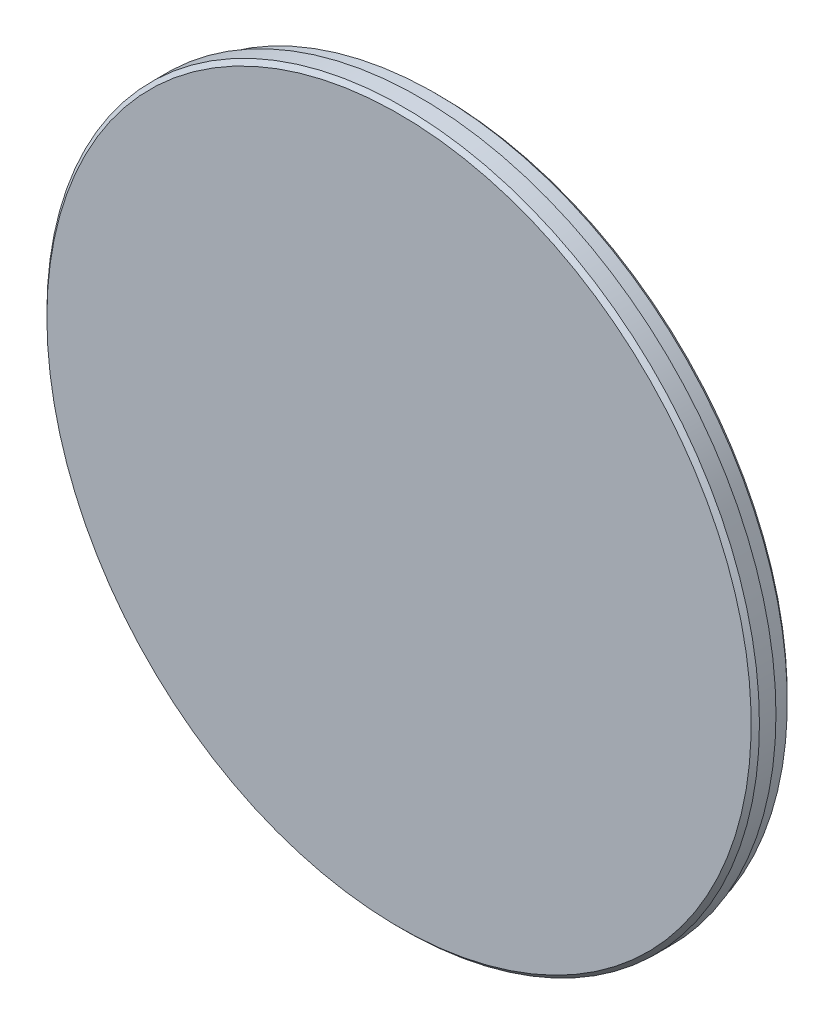
ISO-10303-21;
HEADER;
FILE_DESCRIPTION(('STEP AP214'),'2;1');
FILE_NAME('part.step','',(''),(''),'','','');
FILE_SCHEMA(('AUTOMOTIVE_DESIGN { 1 0 10303 214 1 1 1 1 }'));
ENDSEC;
DATA;
#1=APPLICATION_CONTEXT('core data for automotive mechanical design processes');
#2=APPLICATION_PROTOCOL_DEFINITION('international standard','automotive_design',2000,#1);
#3=PRODUCT_CONTEXT('',#1,'mechanical');
#4=PRODUCT('Part','Part','',(#3));
#5=PRODUCT_RELATED_PRODUCT_CATEGORY('part','',(#4));
#6=PRODUCT_DEFINITION_FORMATION('','',#4);
#7=PRODUCT_DEFINITION_CONTEXT('part definition',#1,'design');
#8=PRODUCT_DEFINITION('design','',#6,#7);
#9=PRODUCT_DEFINITION_SHAPE('','',#8);
#10=(LENGTH_UNIT() NAMED_UNIT(*) SI_UNIT(.MILLI.,.METRE.));
#11=(NAMED_UNIT(*) PLANE_ANGLE_UNIT() SI_UNIT($,.RADIAN.));
#12=(NAMED_UNIT(*) SI_UNIT($,.STERADIAN.) SOLID_ANGLE_UNIT());
#13=UNCERTAINTY_MEASURE_WITH_UNIT(LENGTH_MEASURE(1.E-05),#10,'distance_accuracy_value','');
#14=(GEOMETRIC_REPRESENTATION_CONTEXT(3) GLOBAL_UNCERTAINTY_ASSIGNED_CONTEXT((#13)) GLOBAL_UNIT_ASSIGNED_CONTEXT((#10,
#11,#12)) REPRESENTATION_CONTEXT('',''));
#15=CARTESIAN_POINT('',(0.,0.,0.));
#16=DIRECTION('',(0.,0.,1.));
#17=DIRECTION('',(1.,0.,0.));
#18=AXIS2_PLACEMENT_3D('',#15,#16,#17);
#19=CARTESIAN_POINT('',(0.,0.,-1.));
#20=DIRECTION('',(0.,0.,1.));
#21=DIRECTION('',(1.,0.,0.));
#22=AXIS2_PLACEMENT_3D('',#19,#20,#21);
#23=CYLINDRICAL_SURFACE('',#22,17.25);
#24=CARTESIAN_POINT('',(0.,0.,-0.199999999999988));
#25=DIRECTION('',(0.,0.,1.));
#26=DIRECTION('',(1.,0.,0.));
#27=AXIS2_PLACEMENT_3D('',#24,#25,#26);
#28=CIRCLE('',#27,17.25);
#29=CARTESIAN_POINT('',(-17.25,0.,-0.199999999999988));
#30=VERTEX_POINT('',#29);
#31=EDGE_CURVE('E10',#30,#30,#28,.F.);
#32=ORIENTED_EDGE('',*,*,#31,.T.);
#33=EDGE_LOOP('',(#32));
#34=FACE_BOUND('',#33,.T.);
#35=CARTESIAN_POINT('',(0.,0.,-1.));
#36=DIRECTION('',(0.,0.,1.));
#37=DIRECTION('',(1.,0.,0.));
#38=AXIS2_PLACEMENT_3D('',#35,#36,#37);
#39=CIRCLE('',#38,17.25);
#40=CARTESIAN_POINT('',(17.25,0.,-1.));
#41=VERTEX_POINT('',#40);
#42=EDGE_CURVE('E55',#41,#41,#39,.T.);
#43=ORIENTED_EDGE('',*,*,#42,.T.);
#44=EDGE_LOOP('',(#43));
#45=FACE_BOUND('',#44,.T.);
#46=ADVANCED_FACE('F33',(#34,#45),#23,.T.);
#47=CARTESIAN_POINT('',(0.,0.,-1.));
#48=DIRECTION('',(0.,0.,1.));
#49=DIRECTION('',(1.,0.,0.));
#50=AXIS2_PLACEMENT_3D('',#47,#48,#49);
#51=PLANE('',#50);
#52=CARTESIAN_POINT('',(0.,0.,-1.));
#53=DIRECTION('',(0.,0.,-1.));
#54=DIRECTION('',(-1.,0.,0.));
#55=AXIS2_PLACEMENT_3D('',#52,#53,#54);
#56=CIRCLE('',#55,17.);
#57=CARTESIAN_POINT('',(-17.,0.,-1.));
#58=VERTEX_POINT('',#57);
#59=EDGE_CURVE('E54',#58,#58,#56,.T.);
#60=ORIENTED_EDGE('',*,*,#59,.F.);
#61=EDGE_LOOP('',(#60));
#62=FACE_BOUND('',#61,.T.);
#63=ORIENTED_EDGE('',*,*,#42,.F.);
#64=EDGE_LOOP('',(#63));
#65=FACE_BOUND('',#64,.T.);
#66=ADVANCED_FACE('F63',(#62,#65),#51,.F.);
#67=CARTESIAN_POINT('',(0.,0.,0.));
#68=DIRECTION('',(0.,0.,1.));
#69=DIRECTION('',(1.,0.,0.));
#70=AXIS2_PLACEMENT_3D('',#67,#68,#69);
#71=PLANE('',#70);
#72=CARTESIAN_POINT('',(0.,0.,0.));
#73=DIRECTION('',(0.,0.,1.));
#74=DIRECTION('',(1.,0.,0.));
#75=AXIS2_PLACEMENT_3D('',#72,#73,#74);
#76=CIRCLE('',#75,17.05);
#77=CARTESIAN_POINT('',(-17.05,0.,0.));
#78=VERTEX_POINT('',#77);
#79=EDGE_CURVE('E41',#78,#78,#76,.T.);
#80=ORIENTED_EDGE('',*,*,#79,.T.);
#81=EDGE_LOOP('',(#80));
#82=FACE_BOUND('',#81,.T.);
#83=ADVANCED_FACE('F66',(#82),#71,.T.);
#84=CARTESIAN_POINT('',(0.,0.,-2.));
#85=DIRECTION('',(0.,0.,1.));
#86=DIRECTION('',(1.,0.,0.));
#87=AXIS2_PLACEMENT_3D('',#84,#85,#86);
#88=CYLINDRICAL_SURFACE('',#87,17.);
#89=CARTESIAN_POINT('',(0.,0.,-1.8));
#90=DIRECTION('',(0.,0.,-1.));
#91=DIRECTION('',(-1.,0.,0.));
#92=AXIS2_PLACEMENT_3D('',#89,#90,#91);
#93=CIRCLE('',#92,17.);
#94=CARTESIAN_POINT('',(-17.,0.,-1.8));
#95=VERTEX_POINT('',#94);
#96=EDGE_CURVE('E45',#95,#95,#93,.F.);
#97=ORIENTED_EDGE('',*,*,#96,.T.);
#98=EDGE_LOOP('',(#97));
#99=FACE_BOUND('',#98,.T.);
#100=ORIENTED_EDGE('',*,*,#59,.T.);
#101=EDGE_LOOP('',(#100));
#102=FACE_BOUND('',#101,.T.);
#103=ADVANCED_FACE('F61',(#99,#102),#88,.T.);
#104=CARTESIAN_POINT('',(0.,0.,-2.));
#105=DIRECTION('',(0.,0.,-1.));
#106=DIRECTION('',(-1.,0.,0.));
#107=AXIS2_PLACEMENT_3D('',#104,#105,#106);
#108=PLANE('',#107);
#109=CARTESIAN_POINT('',(0.,0.,-2.));
#110=DIRECTION('',(0.,0.,-1.));
#111=DIRECTION('',(-1.,0.,0.));
#112=AXIS2_PLACEMENT_3D('',#109,#110,#111);
#113=CIRCLE('',#112,16.8);
#114=CARTESIAN_POINT('',(-16.8,0.,-2.));
#115=VERTEX_POINT('',#114);
#116=EDGE_CURVE('E49',#115,#115,#113,.T.);
#117=ORIENTED_EDGE('',*,*,#116,.T.);
#118=EDGE_LOOP('',(#117));
#119=FACE_BOUND('',#118,.T.);
#120=ADVANCED_FACE('F80',(#119),#108,.T.);
#121=CARTESIAN_POINT('',(0.,0.,-2.));
#122=DIRECTION('',(0.,0.,1.));
#123=DIRECTION('',(1.,0.,0.));
#124=AXIS2_PLACEMENT_3D('',#121,#122,#123);
#125=CONICAL_SURFACE('',#124,16.8,0.785398163397457);
#126=ORIENTED_EDGE('',*,*,#96,.F.);
#127=EDGE_LOOP('',(#126));
#128=FACE_BOUND('',#127,.T.);
#129=ORIENTED_EDGE('',*,*,#116,.F.);
#130=EDGE_LOOP('',(#129));
#131=FACE_BOUND('',#130,.T.);
#132=ADVANCED_FACE('F76',(#128,#131),#125,.T.);
#133=CARTESIAN_POINT('',(0.,0.,0.));
#134=DIRECTION('',(0.,0.,-1.));
#135=DIRECTION('',(-1.,0.,0.));
#136=AXIS2_PLACEMENT_3D('',#133,#134,#135);
#137=CONICAL_SURFACE('',#136,17.05,0.785398163397466);
#138=CARTESIAN_POINT('',(-17.25,0.,-0.199999999999988));
#139=CARTESIAN_POINT('',(-17.2479166666667,0.,-0.197916666666655));
#140=CARTESIAN_POINT('',(-17.2458333333333,0.,-0.195833333333322));
#141=CARTESIAN_POINT('',(-17.2416666666667,0.,-0.191666666666656));
#142=CARTESIAN_POINT('',(-17.2395833333333,0.,-0.189583333333322));
#143=CARTESIAN_POINT('',(-17.2354166666667,0.,-0.185416666666656));
#144=CARTESIAN_POINT('',(-17.2333333333333,0.,-0.183333333333322));
#145=CARTESIAN_POINT('',(-17.2291666666667,0.,-0.179166666666656));
#146=CARTESIAN_POINT('',(-17.2270833333333,0.,-0.177083333333323));
#147=CARTESIAN_POINT('',(-17.2229166666667,0.,-0.172916666666657));
#148=CARTESIAN_POINT('',(-17.2208333333333,0.,-0.170833333333324));
#149=CARTESIAN_POINT('',(-17.2166666666667,0.,-0.166666666666657));
#150=CARTESIAN_POINT('',(-17.2145833333333,0.,-0.164583333333324));
#151=CARTESIAN_POINT('',(-17.2104166666667,0.,-0.160416666666657));
#152=CARTESIAN_POINT('',(-17.2083333333333,0.,-0.158333333333324));
#153=CARTESIAN_POINT('',(-17.2041666666667,0.,-0.154166666666658));
#154=CARTESIAN_POINT('',(-17.2020833333333,0.,-0.152083333333325));
#155=CARTESIAN_POINT('',(-17.1979166666667,0.,-0.147916666666658));
#156=CARTESIAN_POINT('',(-17.1958333333333,0.,-0.145833333333325));
#157=CARTESIAN_POINT('',(-17.1916666666667,0.,-0.141666666666658));
#158=CARTESIAN_POINT('',(-17.1895833333333,0.,-0.139583333333325));
#159=CARTESIAN_POINT('',(-17.1854166666667,0.,-0.135416666666659));
#160=CARTESIAN_POINT('',(-17.1833333333333,0.,-0.133333333333326));
#161=CARTESIAN_POINT('',(-17.1791666666667,0.,-0.129166666666659));
#162=CARTESIAN_POINT('',(-17.1770833333333,0.,-0.127083333333326));
#163=CARTESIAN_POINT('',(-17.1729166666667,0.,-0.12291666666666));
#164=CARTESIAN_POINT('',(-17.1708333333333,0.,-0.120833333333326));
#165=CARTESIAN_POINT('',(-17.1666666666667,0.,-0.11666666666666));
#166=CARTESIAN_POINT('',(-17.1645833333333,0.,-0.114583333333327));
#167=CARTESIAN_POINT('',(-17.1604166666667,0.,-0.11041666666666));
#168=CARTESIAN_POINT('',(-17.1583333333333,0.,-0.108333333333327));
#169=CARTESIAN_POINT('',(-17.1541666666667,0.,-0.104166666666661));
#170=CARTESIAN_POINT('',(-17.1520833333333,0.,-0.102083333333327));
#171=CARTESIAN_POINT('',(-17.1479166666667,0.,-0.0979166666666608));
#172=CARTESIAN_POINT('',(-17.1458333333333,0.,-0.095833333333328));
#173=CARTESIAN_POINT('',(-17.1416666666667,0.,-0.0916666666666617));
#174=CARTESIAN_POINT('',(-17.1395833333333,0.,-0.0895833333333282));
#175=CARTESIAN_POINT('',(-17.1354166666667,0.,-0.0854166666666616));
#176=CARTESIAN_POINT('',(-17.1333333333333,0.,-0.0833333333333285));
#177=CARTESIAN_POINT('',(-17.1291666666667,0.,-0.0791666666666621));
#178=CARTESIAN_POINT('',(-17.1270833333333,0.,-0.0770833333333289));
#179=CARTESIAN_POINT('',(-17.1229166666667,0.,-0.0729166666666625));
#180=CARTESIAN_POINT('',(-17.1208333333333,0.,-0.0708333333333293));
#181=CARTESIAN_POINT('',(-17.1166666666667,0.,-0.0666666666666627));
#182=CARTESIAN_POINT('',(-17.1145833333333,0.,-0.0645833333333292));
#183=CARTESIAN_POINT('',(-17.1104166666667,0.,-0.060416666666663));
#184=CARTESIAN_POINT('',(-17.1083333333333,0.,-0.0583333333333302));
#185=CARTESIAN_POINT('',(-17.1041666666667,0.,-0.0541666666666639));
#186=CARTESIAN_POINT('',(-17.1020833333333,0.,-0.0520833333333304));
#187=CARTESIAN_POINT('',(-17.0979166666667,0.,-0.0479166666666638));
#188=CARTESIAN_POINT('',(-17.0958333333333,0.,-0.0458333333333306));
#189=CARTESIAN_POINT('',(-17.0916666666667,0.,-0.0416666666666643));
#190=CARTESIAN_POINT('',(-17.0895833333333,0.,-0.039583333333331));
#191=CARTESIAN_POINT('',(-17.0854166666667,0.,-0.0354166666666646));
#192=CARTESIAN_POINT('',(-17.0833333333333,0.,-0.0333333333333315));
#193=CARTESIAN_POINT('',(-17.0791666666667,0.,-0.0291666666666649));
#194=CARTESIAN_POINT('',(-17.0770833333333,0.,-0.0270833333333314));
#195=CARTESIAN_POINT('',(-17.0729166666667,0.,-0.0229166666666651));
#196=CARTESIAN_POINT('',(-17.0708333333333,0.,-0.0208333333333323));
#197=CARTESIAN_POINT('',(-17.0666666666667,0.,-0.0166666666666661));
#198=CARTESIAN_POINT('',(-17.0645833333333,0.,-0.0145833333333326));
#199=CARTESIAN_POINT('',(-17.0604166666667,0.,-0.010416666666666));
#200=CARTESIAN_POINT('',(-17.0583333333333,0.,-0.0083333333333328));
#201=CARTESIAN_POINT('',(-17.0541666666667,0.,-0.00416666666666648));
#202=CARTESIAN_POINT('',(-17.0520833333333,0.,-0.00208333333333332));
#203=CARTESIAN_POINT('',(-17.05,0.,0.));
#204=B_SPLINE_CURVE_WITH_KNOTS('',3,(#138,#139,#140,#141,#142,#143,#144,#145,#146,#147,#148,
#149,#150,#151,#152,#153,#154,#155,#156,#157,#158,#159,#160,#161,#162,#163,#164,#165,#166,#167,
#168,#169,#170,#171,#172,#173,#174,#175,#176,#177,#178,#179,#180,#181,#182,#183,#184,#185,#186,
#187,#188,#189,#190,#191,#192,#193,#194,#195,#196,#197,#198,#199,#200,#201,#202,#203),
.UNSPECIFIED.,.F.,.F.,(4,2,2,2,2,2,2,2,2,2,2,2,2,2,2,2,2,2,2,2,2,2,2,2,2,2,2,2,2,2,2,2,4),(0.,
0.0088388347648311,0.0176776695296622,0.0265165042944933,0.0353553390593269,0.044194173824158,
0.0530330085889891,0.0618718433538201,0.0707106781186512,0.0795495128834823,0.0883883476483159,
0.097227182413147,0.106066017177978,0.114904851942809,0.12374368670764,0.132582521472471,
0.141421356237302,0.150260191002136,0.159099025766967,0.167937860531798,0.176776695296629,
0.18561553006146,0.194454364826292,0.203293199591125,0.212132034355956,0.220970869120787,
0.229809703885618,0.238648538650449,0.247487373415281,0.256326208180114,0.265165042944945,
0.274003877709776,0.282842712474607),.UNSPECIFIED.);
#205=EDGE_CURVE('BSEAM36',#30,#78,#204,.T.);
#206=ORIENTED_EDGE('',*,*,#31,.F.);
#207=ORIENTED_EDGE('',*,*,#79,.F.);
#208=ORIENTED_EDGE('',*,*,#205,.T.);
#209=ORIENTED_EDGE('',*,*,#205,.F.);
#210=EDGE_LOOP('',(#206,#208,#207,#209));
#211=FACE_BOUND('',#210,.T.);
#212=ADVANCED_FACE('F36',(#211),#137,.T.);
#213=CLOSED_SHELL('',(#46,#66,#83,#103,#120,#132,#212));
#214=MANIFOLD_SOLID_BREP('B2',#213);
#215=ADVANCED_BREP_SHAPE_REPRESENTATION('',(#18,#214),#14);
#216=SHAPE_DEFINITION_REPRESENTATION(#9,#215);
ENDSEC;
END-ISO-10303-21;
